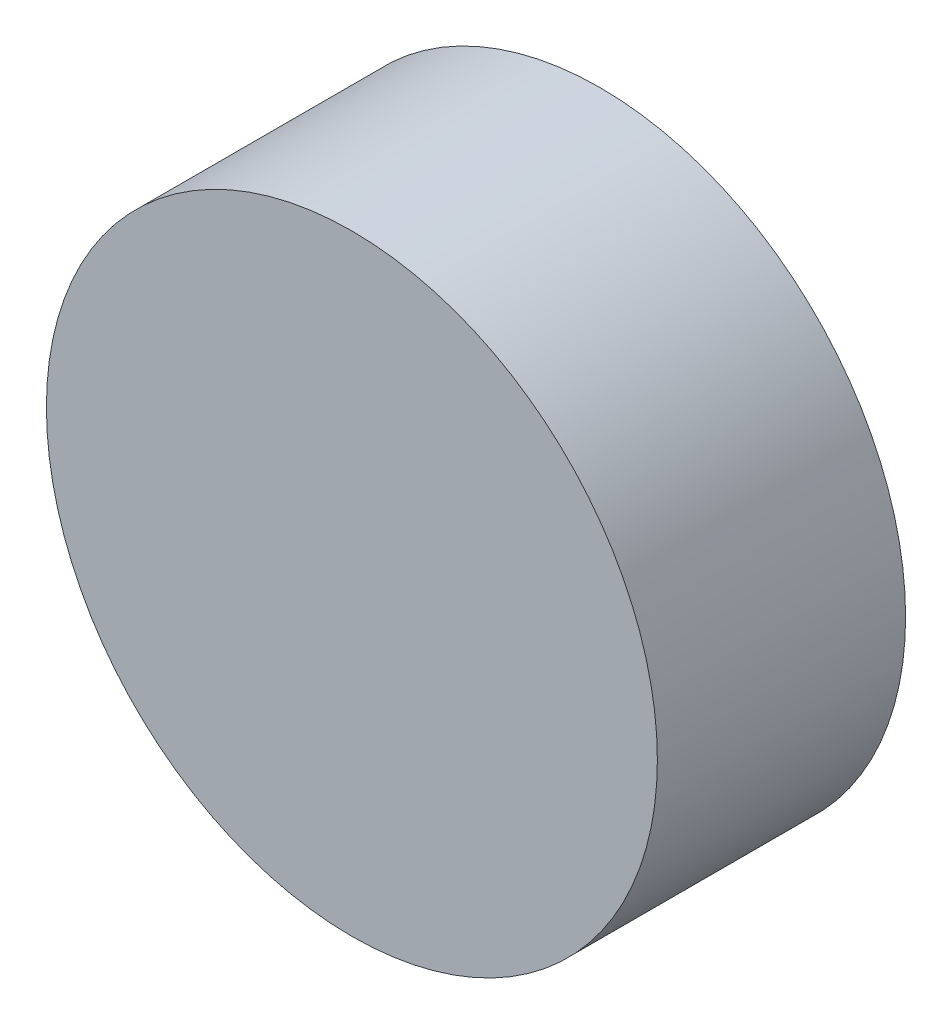
ISO-10303-21;
HEADER;
FILE_DESCRIPTION(('STEP AP214'),'2;1');
FILE_NAME('part.step','',(''),(''),'','','');
FILE_SCHEMA(('AUTOMOTIVE_DESIGN { 1 0 10303 214 1 1 1 1 }'));
ENDSEC;
DATA;
#1=APPLICATION_CONTEXT('core data for automotive mechanical design processes');
#2=APPLICATION_PROTOCOL_DEFINITION('international standard','automotive_design',2000,#1);
#3=PRODUCT_CONTEXT('',#1,'mechanical');
#4=PRODUCT('Part','Part','',(#3));
#5=PRODUCT_RELATED_PRODUCT_CATEGORY('part','',(#4));
#6=PRODUCT_DEFINITION_FORMATION('','',#4);
#7=PRODUCT_DEFINITION_CONTEXT('part definition',#1,'design');
#8=PRODUCT_DEFINITION('design','',#6,#7);
#9=PRODUCT_DEFINITION_SHAPE('','',#8);
#10=(LENGTH_UNIT() NAMED_UNIT(*) SI_UNIT(.MILLI.,.METRE.));
#11=(NAMED_UNIT(*) PLANE_ANGLE_UNIT() SI_UNIT($,.RADIAN.));
#12=(NAMED_UNIT(*) SI_UNIT($,.STERADIAN.) SOLID_ANGLE_UNIT());
#13=UNCERTAINTY_MEASURE_WITH_UNIT(LENGTH_MEASURE(1.E-05),#10,'distance_accuracy_value','');
#14=(GEOMETRIC_REPRESENTATION_CONTEXT(3) GLOBAL_UNCERTAINTY_ASSIGNED_CONTEXT((#13)) GLOBAL_UNIT_ASSIGNED_CONTEXT((#10,
#11,#12)) REPRESENTATION_CONTEXT('',''));
#15=CARTESIAN_POINT('',(0.,0.,0.));
#16=DIRECTION('',(0.,0.,1.));
#17=DIRECTION('',(1.,0.,0.));
#18=AXIS2_PLACEMENT_3D('',#15,#16,#17);
#19=CARTESIAN_POINT('',(-8.41208972314894,9.41352897590476,3.25));
#20=DIRECTION('',(0.,0.,-1.));
#21=DIRECTION('',(-1.,0.,0.));
#22=AXIS2_PLACEMENT_3D('',#19,#20,#21);
#23=CYLINDRICAL_SURFACE('',#22,4.);
#24=CARTESIAN_POINT('',(-8.41208972314894,9.41352897590476,3.25));
#25=DIRECTION('',(0.,0.,1.));
#26=DIRECTION('',(1.,0.,0.));
#27=AXIS2_PLACEMENT_3D('',#24,#25,#26);
#28=CIRCLE('',#27,4.);
#29=CARTESIAN_POINT('',(-12.4120897231489,9.41352897590476,3.25));
#30=VERTEX_POINT('',#29);
#31=EDGE_CURVE('E10',#30,#30,#28,.T.);
#32=CARTESIAN_POINT('',(-8.41208972314894,9.41352897590476,0.));
#33=DIRECTION('',(0.,0.,1.));
#34=DIRECTION('',(1.,0.,0.));
#35=AXIS2_PLACEMENT_3D('',#32,#33,#34);
#36=CIRCLE('',#35,4.);
#37=CARTESIAN_POINT('',(-12.4120897231489,9.41352897590476,0.));
#38=VERTEX_POINT('',#37);
#39=EDGE_CURVE('E36',#38,#38,#36,.T.);
#40=CARTESIAN_POINT('',(-12.4120897231489,9.41352897590476,3.25));
#41=CARTESIAN_POINT('',(-12.4120897231489,9.41352897590476,3.21614583333333));
#42=CARTESIAN_POINT('',(-12.4120897231489,9.41352897590476,3.18229166666667));
#43=CARTESIAN_POINT('',(-12.4120897231489,9.41352897590476,3.11458333333333));
#44=CARTESIAN_POINT('',(-12.4120897231489,9.41352897590476,3.08072916666667));
#45=CARTESIAN_POINT('',(-12.4120897231489,9.41352897590476,3.01302083333333));
#46=CARTESIAN_POINT('',(-12.4120897231489,9.41352897590476,2.97916666666667));
#47=CARTESIAN_POINT('',(-12.4120897231489,9.41352897590476,2.91145833333333));
#48=CARTESIAN_POINT('',(-12.4120897231489,9.41352897590476,2.87760416666667));
#49=CARTESIAN_POINT('',(-12.4120897231489,9.41352897590476,2.80989583333333));
#50=CARTESIAN_POINT('',(-12.4120897231489,9.41352897590476,2.77604166666667));
#51=CARTESIAN_POINT('',(-12.4120897231489,9.41352897590476,2.70833333333333));
#52=CARTESIAN_POINT('',(-12.4120897231489,9.41352897590476,2.67447916666667));
#53=CARTESIAN_POINT('',(-12.4120897231489,9.41352897590476,2.60677083333333));
#54=CARTESIAN_POINT('',(-12.4120897231489,9.41352897590476,2.57291666666667));
#55=CARTESIAN_POINT('',(-12.4120897231489,9.41352897590476,2.50520833333333));
#56=CARTESIAN_POINT('',(-12.4120897231489,9.41352897590476,2.47135416666667));
#57=CARTESIAN_POINT('',(-12.4120897231489,9.41352897590476,2.40364583333333));
#58=CARTESIAN_POINT('',(-12.4120897231489,9.41352897590476,2.36979166666667));
#59=CARTESIAN_POINT('',(-12.4120897231489,9.41352897590476,2.30208333333333));
#60=CARTESIAN_POINT('',(-12.4120897231489,9.41352897590476,2.26822916666667));
#61=CARTESIAN_POINT('',(-12.4120897231489,9.41352897590476,2.20052083333333));
#62=CARTESIAN_POINT('',(-12.4120897231489,9.41352897590476,2.16666666666667));
#63=CARTESIAN_POINT('',(-12.4120897231489,9.41352897590476,2.09895833333333));
#64=CARTESIAN_POINT('',(-12.4120897231489,9.41352897590476,2.06510416666667));
#65=CARTESIAN_POINT('',(-12.4120897231489,9.41352897590476,1.99739583333333));
#66=CARTESIAN_POINT('',(-12.4120897231489,9.41352897590476,1.96354166666667));
#67=CARTESIAN_POINT('',(-12.4120897231489,9.41352897590476,1.89583333333333));
#68=CARTESIAN_POINT('',(-12.4120897231489,9.41352897590476,1.86197916666667));
#69=CARTESIAN_POINT('',(-12.4120897231489,9.41352897590476,1.79427083333333));
#70=CARTESIAN_POINT('',(-12.4120897231489,9.41352897590476,1.76041666666667));
#71=CARTESIAN_POINT('',(-12.4120897231489,9.41352897590476,1.69270833333333));
#72=CARTESIAN_POINT('',(-12.4120897231489,9.41352897590476,1.65885416666667));
#73=CARTESIAN_POINT('',(-12.4120897231489,9.41352897590476,1.59114583333333));
#74=CARTESIAN_POINT('',(-12.4120897231489,9.41352897590476,1.55729166666667));
#75=CARTESIAN_POINT('',(-12.4120897231489,9.41352897590476,1.48958333333333));
#76=CARTESIAN_POINT('',(-12.4120897231489,9.41352897590476,1.45572916666667));
#77=CARTESIAN_POINT('',(-12.4120897231489,9.41352897590476,1.38802083333333));
#78=CARTESIAN_POINT('',(-12.4120897231489,9.41352897590476,1.35416666666667));
#79=CARTESIAN_POINT('',(-12.4120897231489,9.41352897590476,1.28645833333333));
#80=CARTESIAN_POINT('',(-12.4120897231489,9.41352897590476,1.25260416666667));
#81=CARTESIAN_POINT('',(-12.4120897231489,9.41352897590476,1.18489583333333));
#82=CARTESIAN_POINT('',(-12.4120897231489,9.41352897590476,1.15104166666667));
#83=CARTESIAN_POINT('',(-12.4120897231489,9.41352897590476,1.08333333333333));
#84=CARTESIAN_POINT('',(-12.4120897231489,9.41352897590476,1.04947916666667));
#85=CARTESIAN_POINT('',(-12.4120897231489,9.41352897590476,0.981770833333333));
#86=CARTESIAN_POINT('',(-12.4120897231489,9.41352897590476,0.947916666666667));
#87=CARTESIAN_POINT('',(-12.4120897231489,9.41352897590476,0.880208333333333));
#88=CARTESIAN_POINT('',(-12.4120897231489,9.41352897590476,0.846354166666667));
#89=CARTESIAN_POINT('',(-12.4120897231489,9.41352897590476,0.778645833333333));
#90=CARTESIAN_POINT('',(-12.4120897231489,9.41352897590476,0.744791666666667));
#91=CARTESIAN_POINT('',(-12.4120897231489,9.41352897590476,0.677083333333333));
#92=CARTESIAN_POINT('',(-12.4120897231489,9.41352897590476,0.643229166666667));
#93=CARTESIAN_POINT('',(-12.4120897231489,9.41352897590476,0.575520833333333));
#94=CARTESIAN_POINT('',(-12.4120897231489,9.41352897590476,0.541666666666667));
#95=CARTESIAN_POINT('',(-12.4120897231489,9.41352897590476,0.473958333333333));
#96=CARTESIAN_POINT('',(-12.4120897231489,9.41352897590476,0.440104166666667));
#97=CARTESIAN_POINT('',(-12.4120897231489,9.41352897590476,0.372395833333333));
#98=CARTESIAN_POINT('',(-12.4120897231489,9.41352897590476,0.338541666666667));
#99=CARTESIAN_POINT('',(-12.4120897231489,9.41352897590476,0.270833333333333));
#100=CARTESIAN_POINT('',(-12.4120897231489,9.41352897590476,0.236979166666667));
#101=CARTESIAN_POINT('',(-12.4120897231489,9.41352897590476,0.169270833333333));
#102=CARTESIAN_POINT('',(-12.4120897231489,9.41352897590476,0.135416666666667));
#103=CARTESIAN_POINT('',(-12.4120897231489,9.41352897590476,0.0677083333333334));
#104=CARTESIAN_POINT('',(-12.4120897231489,9.41352897590476,0.0338541666666667));
#105=CARTESIAN_POINT('',(-12.4120897231489,9.41352897590476,0.));
#106=B_SPLINE_CURVE_WITH_KNOTS('',3,(#40,#41,#42,#43,#44,#45,#46,#47,#48,#49,#50,#51,#52,#53,
#54,#55,#56,#57,#58,#59,#60,#61,#62,#63,#64,#65,#66,#67,#68,#69,#70,#71,#72,#73,#74,#75,#76,#77,
#78,#79,#80,#81,#82,#83,#84,#85,#86,#87,#88,#89,#90,#91,#92,#93,#94,#95,#96,#97,#98,#99,#100,
#101,#102,#103,#104,#105),.UNSPECIFIED.,.F.,.F.,(4,2,2,2,2,2,2,2,2,2,2,2,2,2,2,2,2,2,2,2,2,2,2,
2,2,2,2,2,2,2,2,2,4),(0.,0.1015625,0.203125,0.3046875,0.40625,0.5078125,0.609375,0.7109375,
0.8125,0.9140625,1.015625,1.1171875,1.21875,1.3203125,1.421875,1.5234375,1.625,1.7265625,
1.828125,1.9296875,2.03125,2.1328125,2.234375,2.3359375,2.4375,2.5390625,2.640625,2.7421875,
2.84375,2.9453125,3.046875,3.1484375,3.25),.UNSPECIFIED.);
#107=EDGE_CURVE('BSEAM33',#30,#38,#106,.T.);
#108=ORIENTED_EDGE('',*,*,#31,.F.);
#109=ORIENTED_EDGE('',*,*,#39,.T.);
#110=ORIENTED_EDGE('',*,*,#107,.T.);
#111=ORIENTED_EDGE('',*,*,#107,.F.);
#112=EDGE_LOOP('',(#108,#110,#109,#111));
#113=FACE_BOUND('',#112,.T.);
#114=ADVANCED_FACE('F33',(#113),#23,.T.);
#115=CARTESIAN_POINT('',(-8.41208972314894,9.41352897590476,3.25));
#116=DIRECTION('',(0.,0.,1.));
#117=DIRECTION('',(1.,0.,0.));
#118=AXIS2_PLACEMENT_3D('',#115,#116,#117);
#119=PLANE('',#118);
#120=ORIENTED_EDGE('',*,*,#31,.T.);
#121=EDGE_LOOP('',(#120));
#122=FACE_BOUND('',#121,.T.);
#123=ADVANCED_FACE('F48',(#122),#119,.T.);
#124=CARTESIAN_POINT('',(-8.41208972314894,9.41352897590476,0.));
#125=DIRECTION('',(0.,0.,1.));
#126=DIRECTION('',(1.,0.,0.));
#127=AXIS2_PLACEMENT_3D('',#124,#125,#126);
#128=PLANE('',#127);
#129=ORIENTED_EDGE('',*,*,#39,.F.);
#130=EDGE_LOOP('',(#129));
#131=FACE_BOUND('',#130,.T.);
#132=ADVANCED_FACE('F46',(#131),#128,.F.);
#133=CLOSED_SHELL('',(#114,#123,#132));
#134=MANIFOLD_SOLID_BREP('B2',#133);
#135=ADVANCED_BREP_SHAPE_REPRESENTATION('',(#18,#134),#14);
#136=SHAPE_DEFINITION_REPRESENTATION(#9,#135);
ENDSEC;
END-ISO-10303-21;
